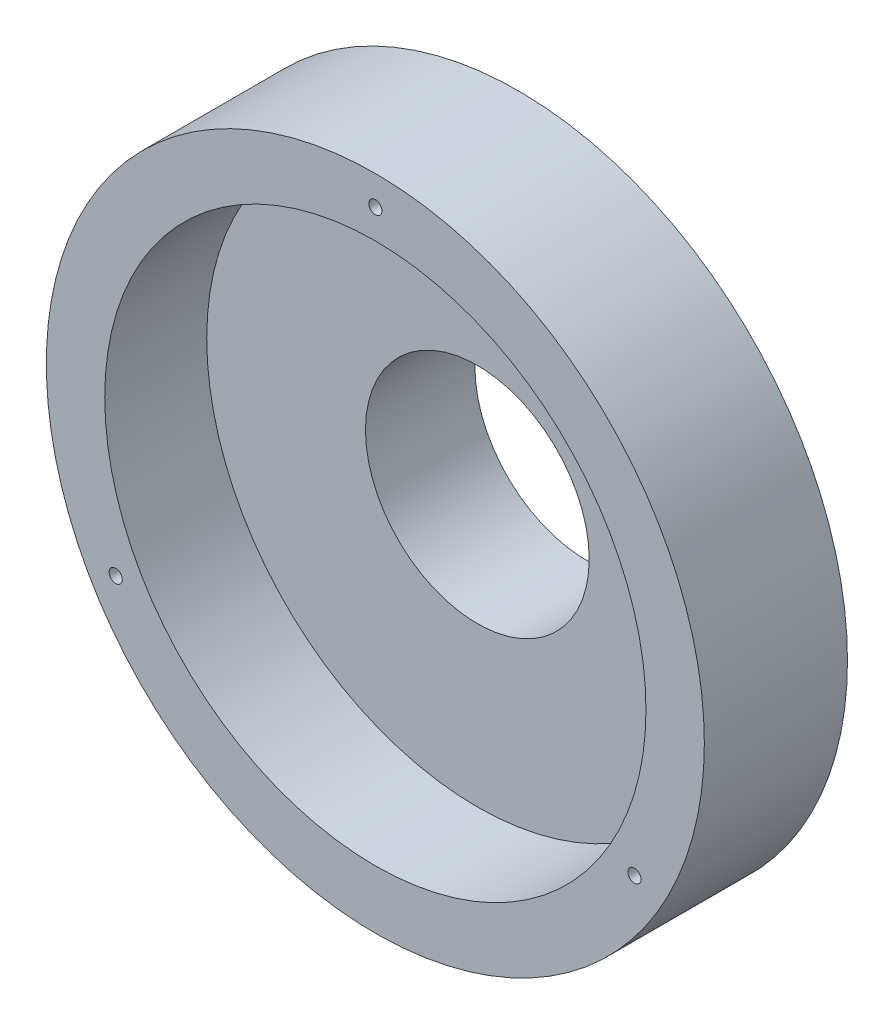
ISO-10303-21;
HEADER;
FILE_DESCRIPTION(('STEP AP214'),'2;1');
FILE_NAME('part.step','',(''),(''),'','','');
FILE_SCHEMA(('AUTOMOTIVE_DESIGN { 1 0 10303 214 1 1 1 1 }'));
ENDSEC;
DATA;
#1=APPLICATION_CONTEXT('core data for automotive mechanical design processes');
#2=APPLICATION_PROTOCOL_DEFINITION('international standard','automotive_design',2000,#1);
#3=PRODUCT_CONTEXT('',#1,'mechanical');
#4=PRODUCT('Part','Part','',(#3));
#5=PRODUCT_RELATED_PRODUCT_CATEGORY('part','',(#4));
#6=PRODUCT_DEFINITION_FORMATION('','',#4);
#7=PRODUCT_DEFINITION_CONTEXT('part definition',#1,'design');
#8=PRODUCT_DEFINITION('design','',#6,#7);
#9=PRODUCT_DEFINITION_SHAPE('','',#8);
#10=(LENGTH_UNIT() NAMED_UNIT(*) SI_UNIT(.MILLI.,.METRE.));
#11=(NAMED_UNIT(*) PLANE_ANGLE_UNIT() SI_UNIT($,.RADIAN.));
#12=(NAMED_UNIT(*) SI_UNIT($,.STERADIAN.) SOLID_ANGLE_UNIT());
#13=UNCERTAINTY_MEASURE_WITH_UNIT(LENGTH_MEASURE(1.E-05),#10,'distance_accuracy_value','');
#14=(GEOMETRIC_REPRESENTATION_CONTEXT(3) GLOBAL_UNCERTAINTY_ASSIGNED_CONTEXT((#13)) GLOBAL_UNIT_ASSIGNED_CONTEXT((#10,
#11,#12)) REPRESENTATION_CONTEXT('',''));
#15=CARTESIAN_POINT('',(0.,0.,0.));
#16=DIRECTION('',(0.,0.,1.));
#17=DIRECTION('',(1.,0.,0.));
#18=AXIS2_PLACEMENT_3D('',#15,#16,#17);
#19=CARTESIAN_POINT('',(0.,0.,3.8));
#20=DIRECTION('',(0.,0.,1.));
#21=DIRECTION('',(1.,0.,0.));
#22=AXIS2_PLACEMENT_3D('',#19,#20,#21);
#23=PLANE('',#22);
#24=CARTESIAN_POINT('',(0.,22.2,3.8));
#25=DIRECTION('',(0.,0.,1.));
#26=DIRECTION('',(1.,0.,0.));
#27=AXIS2_PLACEMENT_3D('',#24,#25,#26);
#28=CIRCLE('',#27,1.);
#29=CARTESIAN_POINT('',(1.,22.2,3.8));
#30=VERTEX_POINT('',#29);
#31=EDGE_CURVE('E95',#30,#30,#28,.T.);
#32=ORIENTED_EDGE('',*,*,#31,.F.);
#33=EDGE_LOOP('',(#32));
#34=FACE_BOUND('',#33,.T.);
#35=CARTESIAN_POINT('',(0.,0.,3.8));
#36=DIRECTION('',(0.,0.,1.));
#37=DIRECTION('',(1.,0.,0.));
#38=AXIS2_PLACEMENT_3D('',#35,#36,#37);
#39=CIRCLE('',#38,24.);
#40=CARTESIAN_POINT('',(-24.,0.,3.8));
#41=VERTEX_POINT('',#40);
#42=EDGE_CURVE('E11',#41,#41,#39,.T.);
#43=ORIENTED_EDGE('',*,*,#42,.T.);
#44=EDGE_LOOP('',(#43));
#45=FACE_BOUND('',#44,.T.);
#46=CARTESIAN_POINT('',(0.,0.,3.8));
#47=DIRECTION('',(0.,0.,1.));
#48=DIRECTION('',(1.,0.,0.));
#49=AXIS2_PLACEMENT_3D('',#46,#47,#48);
#50=CIRCLE('',#49,18.7);
#51=CARTESIAN_POINT('',(18.7,0.,3.8));
#52=VERTEX_POINT('',#51);
#53=EDGE_CURVE('E102',#52,#52,#50,.T.);
#54=ORIENTED_EDGE('',*,*,#53,.F.);
#55=EDGE_LOOP('',(#54));
#56=FACE_BOUND('',#55,.T.);
#57=ADVANCED_FACE('F33',(#34,#45,#56),#23,.T.);
#58=CARTESIAN_POINT('',(0.,0.,3.8));
#59=DIRECTION('',(0.,0.,-1.));
#60=DIRECTION('',(-1.,0.,0.));
#61=AXIS2_PLACEMENT_3D('',#58,#59,#60);
#62=CYLINDRICAL_SURFACE('',#61,24.);
#63=CARTESIAN_POINT('',(0.,0.,0.));
#64=DIRECTION('',(0.,0.,1.));
#65=DIRECTION('',(1.,0.,0.));
#66=AXIS2_PLACEMENT_3D('',#63,#64,#65);
#67=CIRCLE('',#66,24.);
#68=CARTESIAN_POINT('',(-24.,0.,0.));
#69=VERTEX_POINT('',#68);
#70=EDGE_CURVE('E42',#69,#69,#67,.T.);
#71=CARTESIAN_POINT('',(-24.,0.,3.8));
#72=CARTESIAN_POINT('',(-24.,0.,3.76041666666667));
#73=CARTESIAN_POINT('',(-24.,0.,3.72083333333333));
#74=CARTESIAN_POINT('',(-24.,0.,3.64166666666667));
#75=CARTESIAN_POINT('',(-24.,0.,3.60208333333333));
#76=CARTESIAN_POINT('',(-24.,0.,3.52291666666667));
#77=CARTESIAN_POINT('',(-24.,0.,3.48333333333333));
#78=CARTESIAN_POINT('',(-24.,0.,3.40416666666667));
#79=CARTESIAN_POINT('',(-24.,0.,3.36458333333333));
#80=CARTESIAN_POINT('',(-24.,0.,3.28541666666667));
#81=CARTESIAN_POINT('',(-24.,0.,3.24583333333333));
#82=CARTESIAN_POINT('',(-24.,0.,3.16666666666667));
#83=CARTESIAN_POINT('',(-24.,0.,3.12708333333333));
#84=CARTESIAN_POINT('',(-24.,0.,3.04791666666667));
#85=CARTESIAN_POINT('',(-24.,0.,3.00833333333333));
#86=CARTESIAN_POINT('',(-24.,0.,2.92916666666667));
#87=CARTESIAN_POINT('',(-24.,0.,2.88958333333333));
#88=CARTESIAN_POINT('',(-24.,0.,2.81041666666667));
#89=CARTESIAN_POINT('',(-24.,0.,2.77083333333333));
#90=CARTESIAN_POINT('',(-24.,0.,2.69166666666667));
#91=CARTESIAN_POINT('',(-24.,0.,2.65208333333333));
#92=CARTESIAN_POINT('',(-24.,0.,2.57291666666667));
#93=CARTESIAN_POINT('',(-24.,0.,2.53333333333333));
#94=CARTESIAN_POINT('',(-24.,0.,2.45416666666667));
#95=CARTESIAN_POINT('',(-24.,0.,2.41458333333333));
#96=CARTESIAN_POINT('',(-24.,0.,2.33541666666667));
#97=CARTESIAN_POINT('',(-24.,0.,2.29583333333333));
#98=CARTESIAN_POINT('',(-24.,0.,2.21666666666667));
#99=CARTESIAN_POINT('',(-24.,0.,2.17708333333333));
#100=CARTESIAN_POINT('',(-24.,0.,2.09791666666667));
#101=CARTESIAN_POINT('',(-24.,0.,2.05833333333333));
#102=CARTESIAN_POINT('',(-24.,0.,1.97916666666667));
#103=CARTESIAN_POINT('',(-24.,0.,1.93958333333333));
#104=CARTESIAN_POINT('',(-24.,0.,1.86041666666667));
#105=CARTESIAN_POINT('',(-24.,0.,1.82083333333333));
#106=CARTESIAN_POINT('',(-24.,0.,1.74166666666667));
#107=CARTESIAN_POINT('',(-24.,0.,1.70208333333333));
#108=CARTESIAN_POINT('',(-24.,0.,1.62291666666667));
#109=CARTESIAN_POINT('',(-24.,0.,1.58333333333333));
#110=CARTESIAN_POINT('',(-24.,0.,1.50416666666667));
#111=CARTESIAN_POINT('',(-24.,0.,1.46458333333333));
#112=CARTESIAN_POINT('',(-24.,0.,1.38541666666667));
#113=CARTESIAN_POINT('',(-24.,0.,1.34583333333333));
#114=CARTESIAN_POINT('',(-24.,0.,1.26666666666667));
#115=CARTESIAN_POINT('',(-24.,0.,1.22708333333333));
#116=CARTESIAN_POINT('',(-24.,0.,1.14791666666667));
#117=CARTESIAN_POINT('',(-24.,0.,1.10833333333333));
#118=CARTESIAN_POINT('',(-24.,0.,1.02916666666667));
#119=CARTESIAN_POINT('',(-24.,0.,0.989583333333334));
#120=CARTESIAN_POINT('',(-24.,0.,0.910416666666667));
#121=CARTESIAN_POINT('',(-24.,0.,0.870833333333333));
#122=CARTESIAN_POINT('',(-24.,0.,0.791666666666667));
#123=CARTESIAN_POINT('',(-24.,0.,0.752083333333333));
#124=CARTESIAN_POINT('',(-24.,0.,0.672916666666667));
#125=CARTESIAN_POINT('',(-24.,0.,0.633333333333333));
#126=CARTESIAN_POINT('',(-24.,0.,0.554166666666667));
#127=CARTESIAN_POINT('',(-24.,0.,0.514583333333334));
#128=CARTESIAN_POINT('',(-24.,0.,0.435416666666667));
#129=CARTESIAN_POINT('',(-24.,0.,0.395833333333334));
#130=CARTESIAN_POINT('',(-24.,0.,0.316666666666667));
#131=CARTESIAN_POINT('',(-24.,0.,0.277083333333333));
#132=CARTESIAN_POINT('',(-24.,0.,0.197916666666667));
#133=CARTESIAN_POINT('',(-24.,0.,0.158333333333333));
#134=CARTESIAN_POINT('',(-24.,0.,0.0791666666666666));
#135=CARTESIAN_POINT('',(-24.,0.,0.0395833333333333));
#136=CARTESIAN_POINT('',(-24.,0.,0.));
#137=B_SPLINE_CURVE_WITH_KNOTS('',3,(#71,#72,#73,#74,#75,#76,#77,#78,#79,#80,#81,#82,#83,#84,
#85,#86,#87,#88,#89,#90,#91,#92,#93,#94,#95,#96,#97,#98,#99,#100,#101,#102,#103,#104,#105,#106,
#107,#108,#109,#110,#111,#112,#113,#114,#115,#116,#117,#118,#119,#120,#121,#122,#123,#124,#125,
#126,#127,#128,#129,#130,#131,#132,#133,#134,#135,#136),.UNSPECIFIED.,.F.,.F.,(4,2,2,2,2,2,2,2,
2,2,2,2,2,2,2,2,2,2,2,2,2,2,2,2,2,2,2,2,2,2,2,2,4),(0.,0.11875,0.2375,0.35625,0.475,0.59375,
0.7125,0.83125,0.95,1.06875,1.1875,1.30625,1.425,1.54375,1.6625,1.78125,1.9,2.01875,2.1375,
2.25625,2.375,2.49375,2.6125,2.73125,2.85,2.96875,3.0875,3.20625,3.325,3.44375,3.5625,3.68125,
3.8),.UNSPECIFIED.);
#138=EDGE_CURVE('BSEAM35',#41,#69,#137,.T.);
#139=ORIENTED_EDGE('',*,*,#42,.F.);
#140=ORIENTED_EDGE('',*,*,#70,.T.);
#141=ORIENTED_EDGE('',*,*,#138,.T.);
#142=ORIENTED_EDGE('',*,*,#138,.F.);
#143=EDGE_LOOP('',(#139,#141,#140,#142));
#144=FACE_BOUND('',#143,.T.);
#145=ADVANCED_FACE('F35',(#144),#62,.T.);
#146=CARTESIAN_POINT('',(0.,0.,0.));
#147=DIRECTION('',(0.,0.,1.));
#148=DIRECTION('',(1.,0.,0.));
#149=AXIS2_PLACEMENT_3D('',#146,#147,#148);
#150=PLANE('',#149);
#151=CARTESIAN_POINT('',(0.,0.,0.));
#152=DIRECTION('',(0.,0.,1.));
#153=DIRECTION('',(1.,0.,0.));
#154=AXIS2_PLACEMENT_3D('',#151,#152,#153);
#155=CIRCLE('',#154,13.6);
#156=CARTESIAN_POINT('',(13.6,0.,0.));
#157=VERTEX_POINT('',#156);
#158=EDGE_CURVE('E90',#157,#157,#155,.T.);
#159=ORIENTED_EDGE('',*,*,#158,.T.);
#160=EDGE_LOOP('',(#159));
#161=FACE_BOUND('',#160,.T.);
#162=CARTESIAN_POINT('',(0.,22.2,0.));
#163=DIRECTION('',(0.,0.,1.));
#164=DIRECTION('',(1.,0.,0.));
#165=AXIS2_PLACEMENT_3D('',#162,#163,#164);
#166=CIRCLE('',#165,1.);
#167=CARTESIAN_POINT('',(1.,22.2,0.));
#168=VERTEX_POINT('',#167);
#169=EDGE_CURVE('E98',#168,#168,#166,.T.);
#170=ORIENTED_EDGE('',*,*,#169,.T.);
#171=EDGE_LOOP('',(#170));
#172=FACE_BOUND('',#171,.T.);
#173=ORIENTED_EDGE('',*,*,#70,.F.);
#174=EDGE_LOOP('',(#173));
#175=FACE_BOUND('',#174,.T.);
#176=ADVANCED_FACE('F109',(#161,#172,#175),#150,.F.);
#177=CARTESIAN_POINT('',(0.,0.,8.3));
#178=DIRECTION('',(0.,0.,-1.));
#179=DIRECTION('',(-1.,0.,0.));
#180=AXIS2_PLACEMENT_3D('',#177,#178,#179);
#181=CYLINDRICAL_SURFACE('',#180,18.7);
#182=CARTESIAN_POINT('',(0.,0.,8.3));
#183=DIRECTION('',(0.,0.,1.));
#184=DIRECTION('',(1.,0.,0.));
#185=AXIS2_PLACEMENT_3D('',#182,#183,#184);
#186=CIRCLE('',#185,18.7);
#187=CARTESIAN_POINT('',(18.7,0.,8.3));
#188=VERTEX_POINT('',#187);
#189=EDGE_CURVE('E99',#188,#188,#186,.T.);
#190=ORIENTED_EDGE('',*,*,#189,.F.);
#191=EDGE_LOOP('',(#190));
#192=FACE_BOUND('',#191,.T.);
#193=ORIENTED_EDGE('',*,*,#53,.T.);
#194=EDGE_LOOP('',(#193));
#195=FACE_BOUND('',#194,.T.);
#196=ADVANCED_FACE('F115',(#192,#195),#181,.T.);
#197=CARTESIAN_POINT('',(0.,22.2,-0.700000000000001));
#198=DIRECTION('',(0.,0.,1.));
#199=DIRECTION('',(1.,0.,0.));
#200=AXIS2_PLACEMENT_3D('',#197,#198,#199);
#201=CYLINDRICAL_SURFACE('',#200,1.);
#202=ORIENTED_EDGE('',*,*,#31,.T.);
#203=EDGE_LOOP('',(#202));
#204=FACE_BOUND('',#203,.T.);
#205=ORIENTED_EDGE('',*,*,#169,.F.);
#206=EDGE_LOOP('',(#205));
#207=FACE_BOUND('',#206,.T.);
#208=ADVANCED_FACE('F112',(#204,#207),#201,.F.);
#209=CARTESIAN_POINT('',(0.,0.,0.));
#210=DIRECTION('',(0.,0.,1.));
#211=DIRECTION('',(1.,0.,0.));
#212=AXIS2_PLACEMENT_3D('',#209,#210,#211);
#213=CYLINDRICAL_SURFACE('',#212,13.6);
#214=CARTESIAN_POINT('',(0.,0.,13.3));
#215=DIRECTION('',(0.,0.,1.));
#216=DIRECTION('',(1.,0.,0.));
#217=AXIS2_PLACEMENT_3D('',#214,#215,#216);
#218=CIRCLE('',#217,13.6);
#219=CARTESIAN_POINT('',(13.6,0.,13.3));
#220=VERTEX_POINT('',#219);
#221=EDGE_CURVE('E37',#220,#220,#218,.T.);
#222=CARTESIAN_POINT('',(13.6,0.,0.));
#223=CARTESIAN_POINT('',(13.6,0.,0.138541666666667));
#224=CARTESIAN_POINT('',(13.6,0.,0.277083333333333));
#225=CARTESIAN_POINT('',(13.6,0.,0.554166666666667));
#226=CARTESIAN_POINT('',(13.6,0.,0.692708333333333));
#227=CARTESIAN_POINT('',(13.6,0.,0.969791666666667));
#228=CARTESIAN_POINT('',(13.6,0.,1.10833333333333));
#229=CARTESIAN_POINT('',(13.6,0.,1.38541666666667));
#230=CARTESIAN_POINT('',(13.6,0.,1.52395833333333));
#231=CARTESIAN_POINT('',(13.6,0.,1.80104166666667));
#232=CARTESIAN_POINT('',(13.6,0.,1.93958333333333));
#233=CARTESIAN_POINT('',(13.6,0.,2.21666666666667));
#234=CARTESIAN_POINT('',(13.6,0.,2.35520833333333));
#235=CARTESIAN_POINT('',(13.6,0.,2.63229166666667));
#236=CARTESIAN_POINT('',(13.6,0.,2.77083333333333));
#237=CARTESIAN_POINT('',(13.6,0.,3.04791666666667));
#238=CARTESIAN_POINT('',(13.6,0.,3.18645833333333));
#239=CARTESIAN_POINT('',(13.6,0.,3.46354166666667));
#240=CARTESIAN_POINT('',(13.6,0.,3.60208333333333));
#241=CARTESIAN_POINT('',(13.6,0.,3.87916666666667));
#242=CARTESIAN_POINT('',(13.6,0.,4.01770833333333));
#243=CARTESIAN_POINT('',(13.6,0.,4.29479166666667));
#244=CARTESIAN_POINT('',(13.6,0.,4.43333333333333));
#245=CARTESIAN_POINT('',(13.6,0.,4.71041666666667));
#246=CARTESIAN_POINT('',(13.6,0.,4.84895833333333));
#247=CARTESIAN_POINT('',(13.6,0.,5.12604166666667));
#248=CARTESIAN_POINT('',(13.6,0.,5.26458333333333));
#249=CARTESIAN_POINT('',(13.6,0.,5.54166666666667));
#250=CARTESIAN_POINT('',(13.6,0.,5.68020833333333));
#251=CARTESIAN_POINT('',(13.6,0.,5.95729166666667));
#252=CARTESIAN_POINT('',(13.6,0.,6.09583333333333));
#253=CARTESIAN_POINT('',(13.6,0.,6.37291666666667));
#254=CARTESIAN_POINT('',(13.6,0.,6.51145833333333));
#255=CARTESIAN_POINT('',(13.6,0.,6.78854166666667));
#256=CARTESIAN_POINT('',(13.6,0.,6.92708333333333));
#257=CARTESIAN_POINT('',(13.6,0.,7.20416666666667));
#258=CARTESIAN_POINT('',(13.6,0.,7.34270833333333));
#259=CARTESIAN_POINT('',(13.6,0.,7.61979166666667));
#260=CARTESIAN_POINT('',(13.6,0.,7.75833333333333));
#261=CARTESIAN_POINT('',(13.6,0.,8.03541666666667));
#262=CARTESIAN_POINT('',(13.6,0.,8.17395833333333));
#263=CARTESIAN_POINT('',(13.6,0.,8.45104166666667));
#264=CARTESIAN_POINT('',(13.6,0.,8.58958333333333));
#265=CARTESIAN_POINT('',(13.6,0.,8.86666666666667));
#266=CARTESIAN_POINT('',(13.6,0.,9.00520833333333));
#267=CARTESIAN_POINT('',(13.6,0.,9.28229166666667));
#268=CARTESIAN_POINT('',(13.6,0.,9.42083333333333));
#269=CARTESIAN_POINT('',(13.6,0.,9.69791666666667));
#270=CARTESIAN_POINT('',(13.6,0.,9.83645833333333));
#271=CARTESIAN_POINT('',(13.6,0.,10.1135416666667));
#272=CARTESIAN_POINT('',(13.6,0.,10.2520833333333));
#273=CARTESIAN_POINT('',(13.6,0.,10.5291666666667));
#274=CARTESIAN_POINT('',(13.6,0.,10.6677083333333));
#275=CARTESIAN_POINT('',(13.6,0.,10.9447916666667));
#276=CARTESIAN_POINT('',(13.6,0.,11.0833333333333));
#277=CARTESIAN_POINT('',(13.6,0.,11.3604166666667));
#278=CARTESIAN_POINT('',(13.6,0.,11.4989583333333));
#279=CARTESIAN_POINT('',(13.6,0.,11.7760416666667));
#280=CARTESIAN_POINT('',(13.6,0.,11.9145833333333));
#281=CARTESIAN_POINT('',(13.6,0.,12.1916666666667));
#282=CARTESIAN_POINT('',(13.6,0.,12.3302083333333));
#283=CARTESIAN_POINT('',(13.6,0.,12.6072916666667));
#284=CARTESIAN_POINT('',(13.6,0.,12.7458333333333));
#285=CARTESIAN_POINT('',(13.6,0.,13.0229166666667));
#286=CARTESIAN_POINT('',(13.6,0.,13.1614583333333));
#287=CARTESIAN_POINT('',(13.6,0.,13.3));
#288=B_SPLINE_CURVE_WITH_KNOTS('',3,(#222,#223,#224,#225,#226,#227,#228,#229,#230,#231,#232,
#233,#234,#235,#236,#237,#238,#239,#240,#241,#242,#243,#244,#245,#246,#247,#248,#249,#250,#251,
#252,#253,#254,#255,#256,#257,#258,#259,#260,#261,#262,#263,#264,#265,#266,#267,#268,#269,#270,
#271,#272,#273,#274,#275,#276,#277,#278,#279,#280,#281,#282,#283,#284,#285,#286,#287),
.UNSPECIFIED.,.F.,.F.,(4,2,2,2,2,2,2,2,2,2,2,2,2,2,2,2,2,2,2,2,2,2,2,2,2,2,2,2,2,2,2,2,4),(0.,
0.415625,0.83125,1.246875,1.6625,2.078125,2.49375,2.909375,3.325,3.740625,4.15625,4.571875,
4.9875,5.403125,5.81875,6.234375,6.65,7.065625,7.48125,7.896875,8.3125,8.728125,9.14375,
9.559375,9.975,10.390625,10.80625,11.221875,11.6375,12.053125,12.46875,12.884375,13.3),.UNSPECIFIED.);
#289=EDGE_CURVE('BSEAM114',#157,#220,#288,.T.);
#290=ORIENTED_EDGE('',*,*,#158,.F.);
#291=ORIENTED_EDGE('',*,*,#221,.T.);
#292=ORIENTED_EDGE('',*,*,#289,.T.);
#293=ORIENTED_EDGE('',*,*,#289,.F.);
#294=EDGE_LOOP('',(#290,#292,#291,#293));
#295=FACE_BOUND('',#294,.T.);
#296=ADVANCED_FACE('F114',(#295),#213,.F.);
#297=CARTESIAN_POINT('',(0.,0.,8.3));
#298=DIRECTION('',(0.,0.,1.));
#299=DIRECTION('',(1.,0.,0.));
#300=AXIS2_PLACEMENT_3D('',#297,#298,#299);
#301=PLANE('',#300);
#302=CARTESIAN_POINT('',(0.,0.,8.3));
#303=DIRECTION('',(0.,0.,1.));
#304=DIRECTION('',(1.,0.,0.));
#305=AXIS2_PLACEMENT_3D('',#302,#303,#304);
#306=CIRCLE('',#305,40.);
#307=CARTESIAN_POINT('',(40.,0.,8.3));
#308=VERTEX_POINT('',#307);
#309=EDGE_CURVE('E83',#308,#308,#306,.T.);
#310=ORIENTED_EDGE('',*,*,#309,.F.);
#311=EDGE_LOOP('',(#310));
#312=FACE_BOUND('',#311,.T.);
#313=ORIENTED_EDGE('',*,*,#189,.T.);
#314=EDGE_LOOP('',(#313));
#315=FACE_BOUND('',#314,.T.);
#316=ADVANCED_FACE('F122',(#312,#315),#301,.F.);
#317=CARTESIAN_POINT('',(0.,0.,25.7));
#318=DIRECTION('',(0.,0.,-1.));
#319=DIRECTION('',(-1.,0.,0.));
#320=AXIS2_PLACEMENT_3D('',#317,#318,#319);
#321=CYLINDRICAL_SURFACE('',#320,40.);
#322=CARTESIAN_POINT('',(0.,0.,25.7));
#323=DIRECTION('',(0.,0.,1.));
#324=DIRECTION('',(1.,0.,0.));
#325=AXIS2_PLACEMENT_3D('',#322,#323,#324);
#326=CIRCLE('',#325,40.);
#327=CARTESIAN_POINT('',(40.,0.,25.7));
#328=VERTEX_POINT('',#327);
#329=EDGE_CURVE('E87',#328,#328,#326,.T.);
#330=ORIENTED_EDGE('',*,*,#329,.F.);
#331=EDGE_LOOP('',(#330));
#332=FACE_BOUND('',#331,.T.);
#333=ORIENTED_EDGE('',*,*,#309,.T.);
#334=EDGE_LOOP('',(#333));
#335=FACE_BOUND('',#334,.T.);
#336=ADVANCED_FACE('F161',(#332,#335),#321,.T.);
#337=CARTESIAN_POINT('',(0.,0.,25.7));
#338=DIRECTION('',(0.,0.,1.));
#339=DIRECTION('',(1.,0.,0.));
#340=AXIS2_PLACEMENT_3D('',#337,#338,#339);
#341=PLANE('',#340);
#342=CARTESIAN_POINT('',(0.,36.45,25.7));
#343=DIRECTION('',(0.,0.,1.));
#344=DIRECTION('',(1.,0.,0.));
#345=AXIS2_PLACEMENT_3D('',#342,#343,#344);
#346=CIRCLE('',#345,0.79999999999999);
#347=CARTESIAN_POINT('',(0.79999999999999,36.45,25.7));
#348=VERTEX_POINT('',#347);
#349=EDGE_CURVE('E64',#348,#348,#346,.T.);
#350=ORIENTED_EDGE('',*,*,#349,.F.);
#351=EDGE_LOOP('',(#350));
#352=FACE_BOUND('',#351,.T.);
#353=CARTESIAN_POINT('',(-31.566625967942,-18.1500000000005,25.7));
#354=DIRECTION('',(0.,0.,1.));
#355=DIRECTION('',(1.,0.,0.));
#356=AXIS2_PLACEMENT_3D('',#353,#354,#355);
#357=CIRCLE('',#356,0.799999999999988);
#358=CARTESIAN_POINT('',(-30.766625967942,-18.1500000000005,25.7));
#359=VERTEX_POINT('',#358);
#360=EDGE_CURVE('E63',#359,#359,#357,.T.);
#361=ORIENTED_EDGE('',*,*,#360,.F.);
#362=EDGE_LOOP('',(#361));
#363=FACE_BOUND('',#362,.T.);
#364=CARTESIAN_POINT('',(31.5016740626597,-18.1874999999996,25.7));
#365=DIRECTION('',(0.,0.,1.));
#366=DIRECTION('',(1.,0.,0.));
#367=AXIS2_PLACEMENT_3D('',#364,#365,#366);
#368=CIRCLE('',#367,0.799999999999988);
#369=CARTESIAN_POINT('',(32.3016740626597,-18.1874999999996,25.7));
#370=VERTEX_POINT('',#369);
#371=EDGE_CURVE('E74',#370,#370,#368,.T.);
#372=ORIENTED_EDGE('',*,*,#371,.F.);
#373=EDGE_LOOP('',(#372));
#374=FACE_BOUND('',#373,.T.);
#375=CARTESIAN_POINT('',(0.,0.,25.7));
#376=DIRECTION('',(0.,0.,1.));
#377=DIRECTION('',(1.,0.,0.));
#378=AXIS2_PLACEMENT_3D('',#375,#376,#377);
#379=CIRCLE('',#378,32.9);
#380=CARTESIAN_POINT('',(32.9,0.,25.7));
#381=VERTEX_POINT('',#380);
#382=EDGE_CURVE('E84',#381,#381,#379,.T.);
#383=ORIENTED_EDGE('',*,*,#382,.F.);
#384=EDGE_LOOP('',(#383));
#385=FACE_BOUND('',#384,.T.);
#386=ORIENTED_EDGE('',*,*,#329,.T.);
#387=EDGE_LOOP('',(#386));
#388=FACE_BOUND('',#387,.T.);
#389=ADVANCED_FACE('F155',(#352,#363,#374,#385,#388),#341,.T.);
#390=CARTESIAN_POINT('',(0.,0.,13.3));
#391=DIRECTION('',(0.,0.,1.));
#392=DIRECTION('',(1.,0.,0.));
#393=AXIS2_PLACEMENT_3D('',#390,#391,#392);
#394=CYLINDRICAL_SURFACE('',#393,32.9);
#395=CARTESIAN_POINT('',(0.,0.,13.3));
#396=DIRECTION('',(0.,0.,1.));
#397=DIRECTION('',(1.,0.,0.));
#398=AXIS2_PLACEMENT_3D('',#395,#396,#397);
#399=CIRCLE('',#398,32.9);
#400=CARTESIAN_POINT('',(32.9,0.,13.3));
#401=VERTEX_POINT('',#400);
#402=EDGE_CURVE('E80',#401,#401,#399,.T.);
#403=CARTESIAN_POINT('',(32.9,0.,13.3));
#404=CARTESIAN_POINT('',(32.9,0.,13.4291666666667));
#405=CARTESIAN_POINT('',(32.9,0.,13.5583333333333));
#406=CARTESIAN_POINT('',(32.9,0.,13.8166666666667));
#407=CARTESIAN_POINT('',(32.9,0.,13.9458333333333));
#408=CARTESIAN_POINT('',(32.9,0.,14.2041666666667));
#409=CARTESIAN_POINT('',(32.9,0.,14.3333333333333));
#410=CARTESIAN_POINT('',(32.9,0.,14.5916666666667));
#411=CARTESIAN_POINT('',(32.9,0.,14.7208333333333));
#412=CARTESIAN_POINT('',(32.9,0.,14.9791666666667));
#413=CARTESIAN_POINT('',(32.9,0.,15.1083333333333));
#414=CARTESIAN_POINT('',(32.9,0.,15.3666666666667));
#415=CARTESIAN_POINT('',(32.9,0.,15.4958333333333));
#416=CARTESIAN_POINT('',(32.9,0.,15.7541666666667));
#417=CARTESIAN_POINT('',(32.9,0.,15.8833333333333));
#418=CARTESIAN_POINT('',(32.9,0.,16.1416666666667));
#419=CARTESIAN_POINT('',(32.9,0.,16.2708333333333));
#420=CARTESIAN_POINT('',(32.9,0.,16.5291666666667));
#421=CARTESIAN_POINT('',(32.9,0.,16.6583333333333));
#422=CARTESIAN_POINT('',(32.9,0.,16.9166666666667));
#423=CARTESIAN_POINT('',(32.9,0.,17.0458333333333));
#424=CARTESIAN_POINT('',(32.9,0.,17.3041666666667));
#425=CARTESIAN_POINT('',(32.9,0.,17.4333333333333));
#426=CARTESIAN_POINT('',(32.9,0.,17.6916666666667));
#427=CARTESIAN_POINT('',(32.9,0.,17.8208333333333));
#428=CARTESIAN_POINT('',(32.9,0.,18.0791666666667));
#429=CARTESIAN_POINT('',(32.9,0.,18.2083333333333));
#430=CARTESIAN_POINT('',(32.9,0.,18.4666666666667));
#431=CARTESIAN_POINT('',(32.9,0.,18.5958333333333));
#432=CARTESIAN_POINT('',(32.9,0.,18.8541666666667));
#433=CARTESIAN_POINT('',(32.9,0.,18.9833333333333));
#434=CARTESIAN_POINT('',(32.9,0.,19.2416666666667));
#435=CARTESIAN_POINT('',(32.9,0.,19.3708333333333));
#436=CARTESIAN_POINT('',(32.9,0.,19.6291666666667));
#437=CARTESIAN_POINT('',(32.9,0.,19.7583333333333));
#438=CARTESIAN_POINT('',(32.9,0.,20.0166666666667));
#439=CARTESIAN_POINT('',(32.9,0.,20.1458333333333));
#440=CARTESIAN_POINT('',(32.9,0.,20.4041666666667));
#441=CARTESIAN_POINT('',(32.9,0.,20.5333333333333));
#442=CARTESIAN_POINT('',(32.9,0.,20.7916666666667));
#443=CARTESIAN_POINT('',(32.9,0.,20.9208333333333));
#444=CARTESIAN_POINT('',(32.9,0.,21.1791666666667));
#445=CARTESIAN_POINT('',(32.9,0.,21.3083333333333));
#446=CARTESIAN_POINT('',(32.9,0.,21.5666666666667));
#447=CARTESIAN_POINT('',(32.9,0.,21.6958333333333));
#448=CARTESIAN_POINT('',(32.9,0.,21.9541666666667));
#449=CARTESIAN_POINT('',(32.9,0.,22.0833333333333));
#450=CARTESIAN_POINT('',(32.9,0.,22.3416666666667));
#451=CARTESIAN_POINT('',(32.9,0.,22.4708333333333));
#452=CARTESIAN_POINT('',(32.9,0.,22.7291666666667));
#453=CARTESIAN_POINT('',(32.9,0.,22.8583333333333));
#454=CARTESIAN_POINT('',(32.9,0.,23.1166666666667));
#455=CARTESIAN_POINT('',(32.9,0.,23.2458333333333));
#456=CARTESIAN_POINT('',(32.9,0.,23.5041666666667));
#457=CARTESIAN_POINT('',(32.9,0.,23.6333333333333));
#458=CARTESIAN_POINT('',(32.9,0.,23.8916666666667));
#459=CARTESIAN_POINT('',(32.9,0.,24.0208333333333));
#460=CARTESIAN_POINT('',(32.9,0.,24.2791666666667));
#461=CARTESIAN_POINT('',(32.9,0.,24.4083333333333));
#462=CARTESIAN_POINT('',(32.9,0.,24.6666666666667));
#463=CARTESIAN_POINT('',(32.9,0.,24.7958333333333));
#464=CARTESIAN_POINT('',(32.9,0.,25.0541666666667));
#465=CARTESIAN_POINT('',(32.9,0.,25.1833333333333));
#466=CARTESIAN_POINT('',(32.9,0.,25.4416666666667));
#467=CARTESIAN_POINT('',(32.9,0.,25.5708333333333));
#468=CARTESIAN_POINT('',(32.9,0.,25.7));
#469=B_SPLINE_CURVE_WITH_KNOTS('',3,(#403,#404,#405,#406,#407,#408,#409,#410,#411,#412,#413,
#414,#415,#416,#417,#418,#419,#420,#421,#422,#423,#424,#425,#426,#427,#428,#429,#430,#431,#432,
#433,#434,#435,#436,#437,#438,#439,#440,#441,#442,#443,#444,#445,#446,#447,#448,#449,#450,#451,
#452,#453,#454,#455,#456,#457,#458,#459,#460,#461,#462,#463,#464,#465,#466,#467,#468),
.UNSPECIFIED.,.F.,.F.,(4,2,2,2,2,2,2,2,2,2,2,2,2,2,2,2,2,2,2,2,2,2,2,2,2,2,2,2,2,2,2,2,4),(0.,
0.387500000000001,0.775000000000001,1.1625,1.55,1.9375,2.325,2.7125,3.1,3.4875,3.875,4.2625,
4.65,5.0375,5.425,5.8125,6.2,6.5875,6.975,7.3625,7.75,8.1375,8.525,8.9125,9.3,9.6875,10.075,
10.4625,10.85,11.2375,11.625,12.0125,12.4),.UNSPECIFIED.);
#470=EDGE_CURVE('BSEAM149',#401,#381,#469,.T.);
#471=ORIENTED_EDGE('',*,*,#402,.F.);
#472=ORIENTED_EDGE('',*,*,#382,.T.);
#473=ORIENTED_EDGE('',*,*,#470,.T.);
#474=ORIENTED_EDGE('',*,*,#470,.F.);
#475=EDGE_LOOP('',(#471,#473,#472,#474));
#476=FACE_BOUND('',#475,.T.);
#477=ADVANCED_FACE('F149',(#476),#394,.F.);
#478=CARTESIAN_POINT('',(0.,0.,13.3));
#479=DIRECTION('',(0.,0.,1.));
#480=DIRECTION('',(1.,0.,0.));
#481=AXIS2_PLACEMENT_3D('',#478,#479,#480);
#482=PLANE('',#481);
#483=ORIENTED_EDGE('',*,*,#221,.F.);
#484=EDGE_LOOP('',(#483));
#485=FACE_BOUND('',#484,.T.);
#486=ORIENTED_EDGE('',*,*,#402,.T.);
#487=EDGE_LOOP('',(#486));
#488=FACE_BOUND('',#487,.T.);
#489=ADVANCED_FACE('F145',(#485,#488),#482,.T.);
#490=CARTESIAN_POINT('',(31.5016740626597,-18.1874999999996,20.7));
#491=DIRECTION('',(0.,0.,1.));
#492=DIRECTION('',(1.,0.,0.));
#493=AXIS2_PLACEMENT_3D('',#490,#491,#492);
#494=CONICAL_SURFACE('',#493,0.799999999999988,1.02974425867665);
#495=CARTESIAN_POINT('',(31.5016740626597,-18.1874999999996,20.219311504778));
#496=VERTEX_POINT('',#495);
#497=VERTEX_LOOP('',#496);
#498=FACE_BOUND('',#497,.T.);
#499=CARTESIAN_POINT('',(31.5016740626597,-18.1874999999996,20.7));
#500=DIRECTION('',(0.,0.,1.));
#501=DIRECTION('',(1.,0.,0.));
#502=AXIS2_PLACEMENT_3D('',#499,#500,#501);
#503=CIRCLE('',#502,0.799999999999988);
#504=CARTESIAN_POINT('',(32.3016740626597,-18.1874999999996,20.7));
#505=VERTEX_POINT('',#504);
#506=EDGE_CURVE('E77',#505,#505,#503,.T.);
#507=ORIENTED_EDGE('',*,*,#506,.T.);
#508=EDGE_LOOP('',(#507));
#509=FACE_BOUND('',#508,.T.);
#510=ADVANCED_FACE('F148',(#498,#509),#494,.F.);
#511=CARTESIAN_POINT('',(31.5016740626597,-18.1874999999996,25.7));
#512=DIRECTION('',(0.,0.,1.));
#513=DIRECTION('',(1.,0.,0.));
#514=AXIS2_PLACEMENT_3D('',#511,#512,#513);
#515=CYLINDRICAL_SURFACE('',#514,0.799999999999988);
#516=ORIENTED_EDGE('',*,*,#506,.F.);
#517=EDGE_LOOP('',(#516));
#518=FACE_BOUND('',#517,.T.);
#519=ORIENTED_EDGE('',*,*,#371,.T.);
#520=EDGE_LOOP('',(#519));
#521=FACE_BOUND('',#520,.T.);
#522=ADVANCED_FACE('F183',(#518,#521),#515,.F.);
#523=CARTESIAN_POINT('',(-31.566625967942,-18.1500000000005,20.7));
#524=DIRECTION('',(0.,0.,1.));
#525=DIRECTION('',(1.,0.,0.));
#526=AXIS2_PLACEMENT_3D('',#523,#524,#525);
#527=CONICAL_SURFACE('',#526,0.799999999999988,1.02974425867665);
#528=CARTESIAN_POINT('',(-31.566625967942,-18.1500000000005,20.219311504778));
#529=VERTEX_POINT('',#528);
#530=VERTEX_LOOP('',#529);
#531=FACE_BOUND('',#530,.T.);
#532=CARTESIAN_POINT('',(-31.566625967942,-18.1500000000005,20.7));
#533=DIRECTION('',(0.,0.,1.));
#534=DIRECTION('',(1.,0.,0.));
#535=AXIS2_PLACEMENT_3D('',#532,#533,#534);
#536=CIRCLE('',#535,0.799999999999988);
#537=CARTESIAN_POINT('',(-30.766625967942,-18.1500000000005,20.7));
#538=VERTEX_POINT('',#537);
#539=EDGE_CURVE('E67',#538,#538,#536,.T.);
#540=ORIENTED_EDGE('',*,*,#539,.T.);
#541=EDGE_LOOP('',(#540));
#542=FACE_BOUND('',#541,.T.);
#543=ADVANCED_FACE('F186',(#531,#542),#527,.F.);
#544=CARTESIAN_POINT('',(-31.566625967942,-18.1500000000005,25.7));
#545=DIRECTION('',(0.,0.,1.));
#546=DIRECTION('',(1.,0.,0.));
#547=AXIS2_PLACEMENT_3D('',#544,#545,#546);
#548=CYLINDRICAL_SURFACE('',#547,0.799999999999988);
#549=ORIENTED_EDGE('',*,*,#539,.F.);
#550=EDGE_LOOP('',(#549));
#551=FACE_BOUND('',#550,.T.);
#552=ORIENTED_EDGE('',*,*,#360,.T.);
#553=EDGE_LOOP('',(#552));
#554=FACE_BOUND('',#553,.T.);
#555=ADVANCED_FACE('F57',(#551,#554),#548,.F.);
#556=CARTESIAN_POINT('',(0.,36.45,20.7));
#557=DIRECTION('',(0.,0.,1.));
#558=DIRECTION('',(1.,0.,0.));
#559=AXIS2_PLACEMENT_3D('',#556,#557,#558);
#560=CONICAL_SURFACE('',#559,0.799999999999988,1.02974425867665);
#561=CARTESIAN_POINT('',(0.,36.45,20.219311504778));
#562=VERTEX_POINT('',#561);
#563=VERTEX_LOOP('',#562);
#564=FACE_BOUND('',#563,.T.);
#565=CARTESIAN_POINT('',(0.,36.45,20.7));
#566=DIRECTION('',(0.,0.,1.));
#567=DIRECTION('',(1.,0.,0.));
#568=AXIS2_PLACEMENT_3D('',#565,#566,#567);
#569=CIRCLE('',#568,0.799999999999988);
#570=CARTESIAN_POINT('',(0.799999999999988,36.45,20.7));
#571=VERTEX_POINT('',#570);
#572=EDGE_CURVE('E61',#571,#571,#569,.T.);
#573=ORIENTED_EDGE('',*,*,#572,.T.);
#574=EDGE_LOOP('',(#573));
#575=FACE_BOUND('',#574,.T.);
#576=ADVANCED_FACE('F53',(#564,#575),#560,.F.);
#577=CARTESIAN_POINT('',(0.,36.45,25.7));
#578=DIRECTION('',(0.,0.,1.));
#579=DIRECTION('',(1.,0.,0.));
#580=AXIS2_PLACEMENT_3D('',#577,#578,#579);
#581=CYLINDRICAL_SURFACE('',#580,0.799999999999989);
#582=ORIENTED_EDGE('',*,*,#572,.F.);
#583=EDGE_LOOP('',(#582));
#584=FACE_BOUND('',#583,.T.);
#585=ORIENTED_EDGE('',*,*,#349,.T.);
#586=EDGE_LOOP('',(#585));
#587=FACE_BOUND('',#586,.T.);
#588=ADVANCED_FACE('F56',(#584,#587),#581,.F.);
#589=CLOSED_SHELL('',(#57,#145,#176,#196,#208,#296,#316,#336,#389,#477,#489,#510,#522,#543,#555,
#576,#588));
#590=MANIFOLD_SOLID_BREP('B2',#589);
#591=ADVANCED_BREP_SHAPE_REPRESENTATION('',(#18,#590),#14);
#592=SHAPE_DEFINITION_REPRESENTATION(#9,#591);
ENDSEC;
END-ISO-10303-21;
